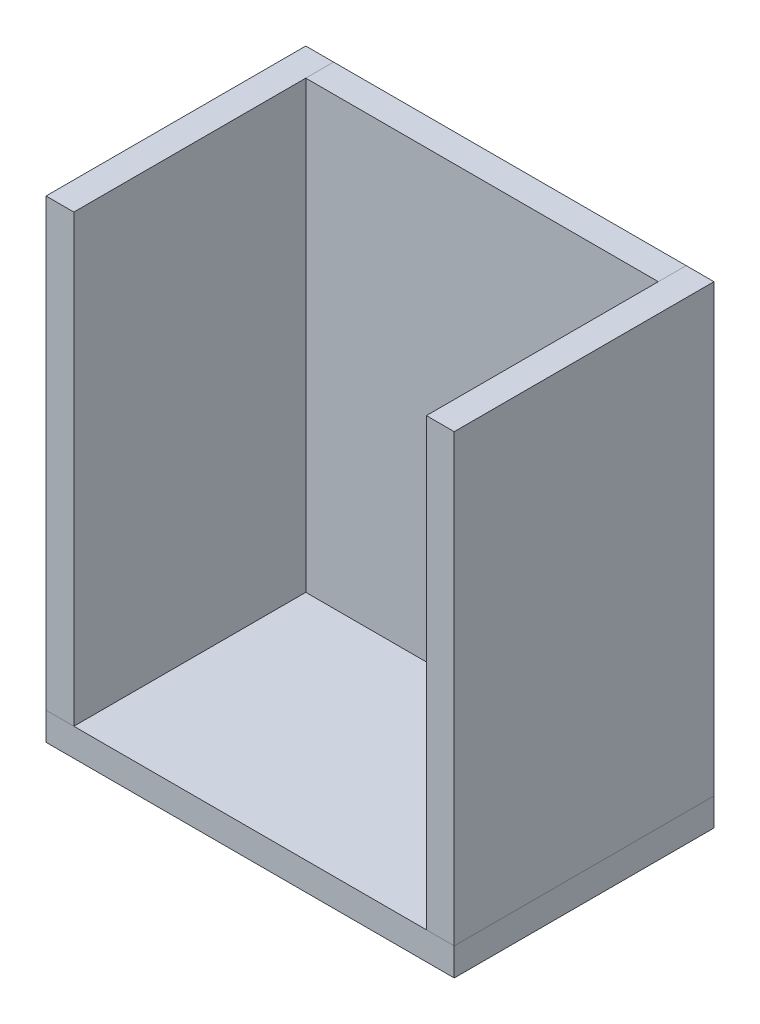
ISO-10303-21;
HEADER;
FILE_DESCRIPTION(('STEP AP214'),'2;1');
FILE_NAME('part.step','',(''),(''),'','','');
FILE_SCHEMA(('AUTOMOTIVE_DESIGN { 1 0 10303 214 1 1 1 1 }'));
ENDSEC;
DATA;
#1=APPLICATION_CONTEXT('core data for automotive mechanical design processes');
#2=APPLICATION_PROTOCOL_DEFINITION('international standard','automotive_design',2000,#1);
#3=PRODUCT_CONTEXT('',#1,'mechanical');
#4=PRODUCT('Part','Part','',(#3));
#5=PRODUCT_RELATED_PRODUCT_CATEGORY('part','',(#4));
#6=PRODUCT_DEFINITION_FORMATION('','',#4);
#7=PRODUCT_DEFINITION_CONTEXT('part definition',#1,'design');
#8=PRODUCT_DEFINITION('design','',#6,#7);
#9=PRODUCT_DEFINITION_SHAPE('','',#8);
#10=(LENGTH_UNIT() NAMED_UNIT(*) SI_UNIT(.MILLI.,.METRE.));
#11=(NAMED_UNIT(*) PLANE_ANGLE_UNIT() SI_UNIT($,.RADIAN.));
#12=(NAMED_UNIT(*) SI_UNIT($,.STERADIAN.) SOLID_ANGLE_UNIT());
#13=UNCERTAINTY_MEASURE_WITH_UNIT(LENGTH_MEASURE(1.E-05),#10,'distance_accuracy_value','');
#14=(GEOMETRIC_REPRESENTATION_CONTEXT(3) GLOBAL_UNCERTAINTY_ASSIGNED_CONTEXT((#13)) GLOBAL_UNIT_ASSIGNED_CONTEXT((#10,
#11,#12)) REPRESENTATION_CONTEXT('',''));
#15=CARTESIAN_POINT('',(0.,0.,0.));
#16=DIRECTION('',(0.,0.,1.));
#17=DIRECTION('',(1.,0.,0.));
#18=AXIS2_PLACEMENT_3D('',#15,#16,#17);
#19=CARTESIAN_POINT('',(-120.65,565.900805617333,0.));
#20=DIRECTION('',(1.,0.,0.));
#21=DIRECTION('',(0.,0.,-1.));
#22=AXIS2_PLACEMENT_3D('',#19,#20,#21);
#23=PLANE('',#22);
#24=DIRECTION('',(0.,0.,1.));
#25=VECTOR('',#24,1.);
#26=CARTESIAN_POINT('',(-120.65,323.85,0.));
#27=LINE('',#26,#25);
#28=CARTESIAN_POINT('',(-120.65,323.85,-88.9));
#29=VERTEX_POINT('',#28);
#30=CARTESIAN_POINT('',(-120.65,323.85,-69.85));
#31=VERTEX_POINT('',#30);
#32=EDGE_CURVE('E66',#29,#31,#27,.T.);
#33=ORIENTED_EDGE('',*,*,#32,.F.);
#34=DIRECTION('',(0.,-1.,0.));
#35=VECTOR('',#34,1.);
#36=CARTESIAN_POINT('',(-120.65,565.900805617333,-88.9));
#37=LINE('',#36,#35);
#38=CARTESIAN_POINT('',(-120.65,19.05,-88.9));
#39=VERTEX_POINT('',#38);
#40=EDGE_CURVE('E60',#29,#39,#37,.T.);
#41=ORIENTED_EDGE('',*,*,#40,.T.);
#42=DIRECTION('',(0.,0.,1.));
#43=VECTOR('',#42,1.);
#44=CARTESIAN_POINT('',(-120.65,19.05,0.));
#45=LINE('',#44,#43);
#46=CARTESIAN_POINT('',(-120.65,19.05,-69.85));
#47=VERTEX_POINT('',#46);
#48=EDGE_CURVE('E124',#39,#47,#45,.T.);
#49=ORIENTED_EDGE('',*,*,#48,.T.);
#50=DIRECTION('',(0.,-1.,0.));
#51=VECTOR('',#50,1.);
#52=CARTESIAN_POINT('',(-120.65,565.900805617333,-69.85));
#53=LINE('',#52,#51);
#54=EDGE_CURVE('E97',#31,#47,#53,.T.);
#55=ORIENTED_EDGE('',*,*,#54,.F.);
#56=EDGE_LOOP('',(#33,#41,#49,#55));
#57=FACE_BOUND('',#56,.T.);
#58=ADVANCED_FACE('F56',(#57),#23,.F.);
#59=CARTESIAN_POINT('',(0.,565.900805617333,-69.85));
#60=DIRECTION('',(0.,0.,-1.));
#61=DIRECTION('',(-1.,0.,0.));
#62=AXIS2_PLACEMENT_3D('',#59,#60,#61);
#63=PLANE('',#62);
#64=DIRECTION('',(1.,0.,0.));
#65=VECTOR('',#64,1.);
#66=CARTESIAN_POINT('',(0.,323.85,-69.85));
#67=LINE('',#66,#65);
#68=CARTESIAN_POINT('',(120.65,323.85,-69.85));
#69=VERTEX_POINT('',#68);
#70=EDGE_CURVE('E12',#31,#69,#67,.T.);
#71=ORIENTED_EDGE('',*,*,#70,.F.);
#72=ORIENTED_EDGE('',*,*,#54,.T.);
#73=DIRECTION('',(1.,0.,0.));
#74=VECTOR('',#73,1.);
#75=CARTESIAN_POINT('',(0.,19.05,-69.85));
#76=LINE('',#75,#74);
#77=CARTESIAN_POINT('',(120.65,19.05,-69.85));
#78=VERTEX_POINT('',#77);
#79=EDGE_CURVE('E111',#47,#78,#76,.T.);
#80=ORIENTED_EDGE('',*,*,#79,.T.);
#81=DIRECTION('',(0.,-1.,0.));
#82=VECTOR('',#81,1.);
#83=CARTESIAN_POINT('',(120.65,565.900805617333,-69.85));
#84=LINE('',#83,#82);
#85=EDGE_CURVE('E108',#69,#78,#84,.T.);
#86=ORIENTED_EDGE('',*,*,#85,.F.);
#87=EDGE_LOOP('',(#71,#72,#80,#86));
#88=FACE_BOUND('',#87,.T.);
#89=ADVANCED_FACE('F113',(#88),#63,.F.);
#90=CARTESIAN_POINT('',(120.65,565.900805617333,0.));
#91=DIRECTION('',(1.,0.,0.));
#92=DIRECTION('',(0.,0.,-1.));
#93=AXIS2_PLACEMENT_3D('',#90,#91,#92);
#94=PLANE('',#93);
#95=DIRECTION('',(0.,-1.,0.));
#96=VECTOR('',#95,1.);
#97=CARTESIAN_POINT('',(120.65,565.900805617333,-88.9));
#98=LINE('',#97,#96);
#99=CARTESIAN_POINT('',(120.65,323.85,-88.9));
#100=VERTEX_POINT('',#99);
#101=CARTESIAN_POINT('',(120.65,19.05,-88.9));
#102=VERTEX_POINT('',#101);
#103=EDGE_CURVE('E79',#100,#102,#98,.T.);
#104=ORIENTED_EDGE('',*,*,#103,.F.);
#105=DIRECTION('',(0.,0.,1.));
#106=VECTOR('',#105,1.);
#107=CARTESIAN_POINT('',(120.65,323.85,0.));
#108=LINE('',#107,#106);
#109=EDGE_CURVE('E105',#100,#69,#108,.T.);
#110=ORIENTED_EDGE('',*,*,#109,.T.);
#111=ORIENTED_EDGE('',*,*,#85,.T.);
#112=DIRECTION('',(0.,0.,1.));
#113=VECTOR('',#112,1.);
#114=CARTESIAN_POINT('',(120.65,19.05,0.));
#115=LINE('',#114,#113);
#116=EDGE_CURVE('E120',#102,#78,#115,.T.);
#117=ORIENTED_EDGE('',*,*,#116,.F.);
#118=EDGE_LOOP('',(#104,#110,#111,#117));
#119=FACE_BOUND('',#118,.T.);
#120=ADVANCED_FACE('F106',(#119),#94,.T.);
#121=CARTESIAN_POINT('',(0.,565.900805617333,-88.9));
#122=DIRECTION('',(0.,0.,1.));
#123=DIRECTION('',(1.,0.,0.));
#124=AXIS2_PLACEMENT_3D('',#121,#122,#123);
#125=PLANE('',#124);
#126=DIRECTION('',(-1.,0.,0.));
#127=VECTOR('',#126,1.);
#128=CARTESIAN_POINT('',(0.,323.85,-88.9));
#129=LINE('',#128,#127);
#130=EDGE_CURVE('E117',#100,#29,#129,.T.);
#131=ORIENTED_EDGE('',*,*,#130,.F.);
#132=ORIENTED_EDGE('',*,*,#103,.T.);
#133=DIRECTION('',(-1.,0.,0.));
#134=VECTOR('',#133,1.);
#135=CARTESIAN_POINT('',(0.,19.05,-88.9));
#136=LINE('',#135,#134);
#137=EDGE_CURVE('E125',#102,#39,#136,.T.);
#138=ORIENTED_EDGE('',*,*,#137,.T.);
#139=ORIENTED_EDGE('',*,*,#40,.F.);
#140=EDGE_LOOP('',(#131,#132,#138,#139));
#141=FACE_BOUND('',#140,.T.);
#142=ADVANCED_FACE('F144',(#141),#125,.F.);
#143=CARTESIAN_POINT('',(0.,19.05,0.));
#144=DIRECTION('',(0.,1.,0.));
#145=DIRECTION('',(0.,0.,1.));
#146=AXIS2_PLACEMENT_3D('',#143,#144,#145);
#147=PLANE('',#146);
#148=ORIENTED_EDGE('',*,*,#48,.F.);
#149=ORIENTED_EDGE('',*,*,#137,.F.);
#150=ORIENTED_EDGE('',*,*,#116,.T.);
#151=ORIENTED_EDGE('',*,*,#79,.F.);
#152=EDGE_LOOP('',(#148,#149,#150,#151));
#153=FACE_BOUND('',#152,.T.);
#154=ADVANCED_FACE('F147',(#153),#147,.F.);
#155=CARTESIAN_POINT('',(0.,323.85,0.));
#156=DIRECTION('',(0.,1.,0.));
#157=DIRECTION('',(0.,0.,1.));
#158=AXIS2_PLACEMENT_3D('',#155,#156,#157);
#159=PLANE('',#158);
#160=ORIENTED_EDGE('',*,*,#130,.T.);
#161=ORIENTED_EDGE('',*,*,#32,.T.);
#162=ORIENTED_EDGE('',*,*,#70,.T.);
#163=ORIENTED_EDGE('',*,*,#109,.F.);
#164=EDGE_LOOP('',(#160,#161,#162,#163));
#165=FACE_BOUND('',#164,.T.);
#166=ADVANCED_FACE('F58',(#165),#159,.T.);
#167=CLOSED_SHELL('',(#58,#89,#120,#142,#154,#166));
#168=MANIFOLD_SOLID_BREP('B2',#167);
#169=CARTESIAN_POINT('',(0.,323.85,-88.9));
#170=DIRECTION('',(0.,0.,1.));
#171=DIRECTION('',(1.,0.,0.));
#172=AXIS2_PLACEMENT_3D('',#169,#170,#171);
#173=PLANE('',#172);
#174=DIRECTION('',(-1.,0.,0.));
#175=VECTOR('',#174,1.);
#176=CARTESIAN_POINT('',(0.,19.05,-88.9));
#177=LINE('',#176,#175);
#178=CARTESIAN_POINT('',(139.7,19.05,-88.9));
#179=VERTEX_POINT('',#178);
#180=CARTESIAN_POINT('',(120.65,19.05,-88.9));
#181=VERTEX_POINT('',#180);
#182=EDGE_CURVE('E292',#179,#181,#177,.T.);
#183=ORIENTED_EDGE('',*,*,#182,.T.);
#184=DIRECTION('',(0.,-1.,0.));
#185=VECTOR('',#184,1.);
#186=CARTESIAN_POINT('',(120.65,323.85,-88.9));
#187=LINE('',#186,#185);
#188=CARTESIAN_POINT('',(120.65,323.85,-88.9));
#189=VERTEX_POINT('',#188);
#190=EDGE_CURVE('E54',#189,#181,#187,.T.);
#191=ORIENTED_EDGE('',*,*,#190,.F.);
#192=DIRECTION('',(-1.,0.,0.));
#193=VECTOR('',#192,1.);
#194=CARTESIAN_POINT('',(0.,323.85,-88.9));
#195=LINE('',#194,#193);
#196=CARTESIAN_POINT('',(139.7,323.85,-88.9));
#197=VERTEX_POINT('',#196);
#198=EDGE_CURVE('E276',#197,#189,#195,.T.);
#199=ORIENTED_EDGE('',*,*,#198,.F.);
#200=DIRECTION('',(0.,-1.,0.));
#201=VECTOR('',#200,1.);
#202=CARTESIAN_POINT('',(139.7,323.85,-88.9));
#203=LINE('',#202,#201);
#204=EDGE_CURVE('E288',#197,#179,#203,.T.);
#205=ORIENTED_EDGE('',*,*,#204,.T.);
#206=EDGE_LOOP('',(#183,#191,#199,#205));
#207=FACE_BOUND('',#206,.T.);
#208=ADVANCED_FACE('F221',(#207),#173,.F.);
#209=CARTESIAN_POINT('',(120.65,323.85,0.));
#210=DIRECTION('',(1.,0.,0.));
#211=DIRECTION('',(0.,0.,-1.));
#212=AXIS2_PLACEMENT_3D('',#209,#210,#211);
#213=PLANE('',#212);
#214=DIRECTION('',(0.,0.,1.));
#215=VECTOR('',#214,1.);
#216=CARTESIAN_POINT('',(120.65,19.05,0.));
#217=LINE('',#216,#215);
#218=CARTESIAN_POINT('',(120.65,19.05,88.9));
#219=VERTEX_POINT('',#218);
#220=EDGE_CURVE('E281',#181,#219,#217,.T.);
#221=ORIENTED_EDGE('',*,*,#220,.T.);
#222=DIRECTION('',(0.,-1.,0.));
#223=VECTOR('',#222,1.);
#224=CARTESIAN_POINT('',(120.65,323.85,88.9));
#225=LINE('',#224,#223);
#226=CARTESIAN_POINT('',(120.65,323.85,88.9));
#227=VERTEX_POINT('',#226);
#228=EDGE_CURVE('E229',#227,#219,#225,.T.);
#229=ORIENTED_EDGE('',*,*,#228,.F.);
#230=DIRECTION('',(0.,0.,1.));
#231=VECTOR('',#230,1.);
#232=CARTESIAN_POINT('',(120.65,323.85,0.));
#233=LINE('',#232,#231);
#234=EDGE_CURVE('E271',#189,#227,#233,.T.);
#235=ORIENTED_EDGE('',*,*,#234,.F.);
#236=ORIENTED_EDGE('',*,*,#190,.T.);
#237=EDGE_LOOP('',(#221,#229,#235,#236));
#238=FACE_BOUND('',#237,.T.);
#239=ADVANCED_FACE('F280',(#238),#213,.F.);
#240=CARTESIAN_POINT('',(0.,323.85,88.9));
#241=DIRECTION('',(0.,0.,-1.));
#242=DIRECTION('',(-1.,0.,0.));
#243=AXIS2_PLACEMENT_3D('',#240,#241,#242);
#244=PLANE('',#243);
#245=DIRECTION('',(1.,0.,0.));
#246=VECTOR('',#245,1.);
#247=CARTESIAN_POINT('',(0.,19.05,88.9));
#248=LINE('',#247,#246);
#249=CARTESIAN_POINT('',(139.7,19.05,88.9));
#250=VERTEX_POINT('',#249);
#251=EDGE_CURVE('E258',#219,#250,#248,.T.);
#252=ORIENTED_EDGE('',*,*,#251,.T.);
#253=DIRECTION('',(0.,-1.,0.));
#254=VECTOR('',#253,1.);
#255=CARTESIAN_POINT('',(139.7,323.85,88.9));
#256=LINE('',#255,#254);
#257=CARTESIAN_POINT('',(139.7,323.85,88.9));
#258=VERTEX_POINT('',#257);
#259=EDGE_CURVE('E283',#258,#250,#256,.T.);
#260=ORIENTED_EDGE('',*,*,#259,.F.);
#261=DIRECTION('',(1.,0.,0.));
#262=VECTOR('',#261,1.);
#263=CARTESIAN_POINT('',(0.,323.85,88.9));
#264=LINE('',#263,#262);
#265=EDGE_CURVE('E274',#227,#258,#264,.T.);
#266=ORIENTED_EDGE('',*,*,#265,.F.);
#267=ORIENTED_EDGE('',*,*,#228,.T.);
#268=EDGE_LOOP('',(#252,#260,#266,#267));
#269=FACE_BOUND('',#268,.T.);
#270=ADVANCED_FACE('F284',(#269),#244,.F.);
#271=CARTESIAN_POINT('',(139.7,323.85,0.));
#272=DIRECTION('',(-1.,0.,0.));
#273=DIRECTION('',(0.,0.,1.));
#274=AXIS2_PLACEMENT_3D('',#271,#272,#273);
#275=PLANE('',#274);
#276=DIRECTION('',(0.,0.,-1.));
#277=VECTOR('',#276,1.);
#278=CARTESIAN_POINT('',(139.7,19.05,0.));
#279=LINE('',#278,#277);
#280=EDGE_CURVE('E264',#250,#179,#279,.T.);
#281=ORIENTED_EDGE('',*,*,#280,.T.);
#282=ORIENTED_EDGE('',*,*,#204,.F.);
#283=DIRECTION('',(0.,0.,-1.));
#284=VECTOR('',#283,1.);
#285=CARTESIAN_POINT('',(139.7,323.85,0.));
#286=LINE('',#285,#284);
#287=EDGE_CURVE('E237',#258,#197,#286,.T.);
#288=ORIENTED_EDGE('',*,*,#287,.F.);
#289=ORIENTED_EDGE('',*,*,#259,.T.);
#290=EDGE_LOOP('',(#281,#282,#288,#289));
#291=FACE_BOUND('',#290,.T.);
#292=ADVANCED_FACE('F303',(#291),#275,.F.);
#293=CARTESIAN_POINT('',(0.,323.85,0.));
#294=DIRECTION('',(0.,1.,0.));
#295=DIRECTION('',(0.,0.,1.));
#296=AXIS2_PLACEMENT_3D('',#293,#294,#295);
#297=PLANE('',#296);
#298=ORIENTED_EDGE('',*,*,#198,.T.);
#299=ORIENTED_EDGE('',*,*,#234,.T.);
#300=ORIENTED_EDGE('',*,*,#265,.T.);
#301=ORIENTED_EDGE('',*,*,#287,.T.);
#302=EDGE_LOOP('',(#298,#299,#300,#301));
#303=FACE_BOUND('',#302,.T.);
#304=ADVANCED_FACE('F272',(#303),#297,.T.);
#305=CARTESIAN_POINT('',(0.,19.05,0.));
#306=DIRECTION('',(0.,1.,0.));
#307=DIRECTION('',(0.,0.,1.));
#308=AXIS2_PLACEMENT_3D('',#305,#306,#307);
#309=PLANE('',#308);
#310=ORIENTED_EDGE('',*,*,#182,.F.);
#311=ORIENTED_EDGE('',*,*,#280,.F.);
#312=ORIENTED_EDGE('',*,*,#251,.F.);
#313=ORIENTED_EDGE('',*,*,#220,.F.);
#314=EDGE_LOOP('',(#310,#311,#312,#313));
#315=FACE_BOUND('',#314,.T.);
#316=ADVANCED_FACE('F306',(#315),#309,.F.);
#317=CLOSED_SHELL('',(#208,#239,#270,#292,#304,#316));
#318=MANIFOLD_SOLID_BREP('B6',#317);
#319=CARTESIAN_POINT('',(-120.65,323.85,0.));
#320=DIRECTION('',(1.,0.,0.));
#321=DIRECTION('',(0.,0.,-1.));
#322=AXIS2_PLACEMENT_3D('',#319,#320,#321);
#323=PLANE('',#322);
#324=DIRECTION('',(0.,0.,1.));
#325=VECTOR('',#324,1.);
#326=CARTESIAN_POINT('',(-120.65,19.05,0.));
#327=LINE('',#326,#325);
#328=CARTESIAN_POINT('',(-120.65,19.05,-88.9));
#329=VERTEX_POINT('',#328);
#330=CARTESIAN_POINT('',(-120.65,19.05,88.9));
#331=VERTEX_POINT('',#330);
#332=EDGE_CURVE('E461',#329,#331,#327,.T.);
#333=ORIENTED_EDGE('',*,*,#332,.F.);
#334=DIRECTION('',(0.,-1.,0.));
#335=VECTOR('',#334,1.);
#336=CARTESIAN_POINT('',(-120.65,323.85,-88.9));
#337=LINE('',#336,#335);
#338=CARTESIAN_POINT('',(-120.65,323.85,-88.9));
#339=VERTEX_POINT('',#338);
#340=EDGE_CURVE('E219',#339,#329,#337,.T.);
#341=ORIENTED_EDGE('',*,*,#340,.F.);
#342=DIRECTION('',(0.,0.,1.));
#343=VECTOR('',#342,1.);
#344=CARTESIAN_POINT('',(-120.65,323.85,0.));
#345=LINE('',#344,#343);
#346=CARTESIAN_POINT('',(-120.65,323.85,88.9));
#347=VERTEX_POINT('',#346);
#348=EDGE_CURVE('E446',#339,#347,#345,.T.);
#349=ORIENTED_EDGE('',*,*,#348,.T.);
#350=DIRECTION('',(0.,-1.,0.));
#351=VECTOR('',#350,1.);
#352=CARTESIAN_POINT('',(-120.65,323.85,88.9));
#353=LINE('',#352,#351);
#354=EDGE_CURVE('E435',#347,#331,#353,.T.);
#355=ORIENTED_EDGE('',*,*,#354,.T.);
#356=EDGE_LOOP('',(#333,#341,#349,#355));
#357=FACE_BOUND('',#356,.T.);
#358=ADVANCED_FACE('F393',(#357),#323,.T.);
#359=CARTESIAN_POINT('',(0.,323.85,-88.9));
#360=DIRECTION('',(0.,0.,1.));
#361=DIRECTION('',(1.,0.,0.));
#362=AXIS2_PLACEMENT_3D('',#359,#360,#361);
#363=PLANE('',#362);
#364=DIRECTION('',(-1.,0.,0.));
#365=VECTOR('',#364,1.);
#366=CARTESIAN_POINT('',(0.,19.05,-88.9));
#367=LINE('',#366,#365);
#368=CARTESIAN_POINT('',(-139.7,19.05,-88.9));
#369=VERTEX_POINT('',#368);
#370=EDGE_CURVE('E451',#329,#369,#367,.T.);
#371=ORIENTED_EDGE('',*,*,#370,.T.);
#372=DIRECTION('',(0.,-1.,0.));
#373=VECTOR('',#372,1.);
#374=CARTESIAN_POINT('',(-139.7,323.85,-88.9));
#375=LINE('',#374,#373);
#376=CARTESIAN_POINT('',(-139.7,323.85,-88.9));
#377=VERTEX_POINT('',#376);
#378=EDGE_CURVE('E402',#377,#369,#375,.T.);
#379=ORIENTED_EDGE('',*,*,#378,.F.);
#380=DIRECTION('',(-1.,0.,0.));
#381=VECTOR('',#380,1.);
#382=CARTESIAN_POINT('',(0.,323.85,-88.9));
#383=LINE('',#382,#381);
#384=EDGE_CURVE('E441',#339,#377,#383,.T.);
#385=ORIENTED_EDGE('',*,*,#384,.F.);
#386=ORIENTED_EDGE('',*,*,#340,.T.);
#387=EDGE_LOOP('',(#371,#379,#385,#386));
#388=FACE_BOUND('',#387,.T.);
#389=ADVANCED_FACE('F449',(#388),#363,.F.);
#390=CARTESIAN_POINT('',(-139.7,323.85,0.));
#391=DIRECTION('',(1.,0.,0.));
#392=DIRECTION('',(0.,0.,-1.));
#393=AXIS2_PLACEMENT_3D('',#390,#391,#392);
#394=PLANE('',#393);
#395=DIRECTION('',(0.,0.,1.));
#396=VECTOR('',#395,1.);
#397=CARTESIAN_POINT('',(-139.7,19.05,0.));
#398=LINE('',#397,#396);
#399=CARTESIAN_POINT('',(-139.7,19.05,88.9));
#400=VERTEX_POINT('',#399);
#401=EDGE_CURVE('E428',#369,#400,#398,.T.);
#402=ORIENTED_EDGE('',*,*,#401,.T.);
#403=DIRECTION('',(0.,-1.,0.));
#404=VECTOR('',#403,1.);
#405=CARTESIAN_POINT('',(-139.7,323.85,88.9));
#406=LINE('',#405,#404);
#407=CARTESIAN_POINT('',(-139.7,323.85,88.9));
#408=VERTEX_POINT('',#407);
#409=EDGE_CURVE('E453',#408,#400,#406,.T.);
#410=ORIENTED_EDGE('',*,*,#409,.F.);
#411=DIRECTION('',(0.,0.,1.));
#412=VECTOR('',#411,1.);
#413=CARTESIAN_POINT('',(-139.7,323.85,0.));
#414=LINE('',#413,#412);
#415=EDGE_CURVE('E445',#377,#408,#414,.T.);
#416=ORIENTED_EDGE('',*,*,#415,.F.);
#417=ORIENTED_EDGE('',*,*,#378,.T.);
#418=EDGE_LOOP('',(#402,#410,#416,#417));
#419=FACE_BOUND('',#418,.T.);
#420=ADVANCED_FACE('F454',(#419),#394,.F.);
#421=CARTESIAN_POINT('',(0.,323.85,88.9));
#422=DIRECTION('',(0.,0.,-1.));
#423=DIRECTION('',(-1.,0.,0.));
#424=AXIS2_PLACEMENT_3D('',#421,#422,#423);
#425=PLANE('',#424);
#426=DIRECTION('',(1.,0.,0.));
#427=VECTOR('',#426,1.);
#428=CARTESIAN_POINT('',(0.,19.05,88.9));
#429=LINE('',#428,#427);
#430=EDGE_CURVE('E469',#400,#331,#429,.T.);
#431=ORIENTED_EDGE('',*,*,#430,.T.);
#432=ORIENTED_EDGE('',*,*,#354,.F.);
#433=DIRECTION('',(1.,0.,0.));
#434=VECTOR('',#433,1.);
#435=CARTESIAN_POINT('',(0.,323.85,88.9));
#436=LINE('',#435,#434);
#437=EDGE_CURVE('E410',#408,#347,#436,.T.);
#438=ORIENTED_EDGE('',*,*,#437,.F.);
#439=ORIENTED_EDGE('',*,*,#409,.T.);
#440=EDGE_LOOP('',(#431,#432,#438,#439));
#441=FACE_BOUND('',#440,.T.);
#442=ADVANCED_FACE('F474',(#441),#425,.F.);
#443=CARTESIAN_POINT('',(0.,323.85,0.));
#444=DIRECTION('',(0.,1.,0.));
#445=DIRECTION('',(0.,0.,1.));
#446=AXIS2_PLACEMENT_3D('',#443,#444,#445);
#447=PLANE('',#446);
#448=ORIENTED_EDGE('',*,*,#348,.F.);
#449=ORIENTED_EDGE('',*,*,#384,.T.);
#450=ORIENTED_EDGE('',*,*,#415,.T.);
#451=ORIENTED_EDGE('',*,*,#437,.T.);
#452=EDGE_LOOP('',(#448,#449,#450,#451));
#453=FACE_BOUND('',#452,.T.);
#454=ADVANCED_FACE('F443',(#453),#447,.T.);
#455=CARTESIAN_POINT('',(0.,19.05,0.));
#456=DIRECTION('',(0.,1.,0.));
#457=DIRECTION('',(0.,0.,1.));
#458=AXIS2_PLACEMENT_3D('',#455,#456,#457);
#459=PLANE('',#458);
#460=ORIENTED_EDGE('',*,*,#332,.T.);
#461=ORIENTED_EDGE('',*,*,#430,.F.);
#462=ORIENTED_EDGE('',*,*,#401,.F.);
#463=ORIENTED_EDGE('',*,*,#370,.F.);
#464=EDGE_LOOP('',(#460,#461,#462,#463));
#465=FACE_BOUND('',#464,.T.);
#466=ADVANCED_FACE('F476',(#465),#459,.F.);
#467=CLOSED_SHELL('',(#358,#389,#420,#442,#454,#466));
#468=MANIFOLD_SOLID_BREP('B48',#467);
#469=CARTESIAN_POINT('',(139.7,19.05,-88.9));
#470=DIRECTION('',(-1.,0.,0.));
#471=DIRECTION('',(0.,0.,1.));
#472=AXIS2_PLACEMENT_3D('',#469,#470,#471);
#473=PLANE('',#472);
#474=DIRECTION('',(0.,0.,-1.));
#475=VECTOR('',#474,1.);
#476=CARTESIAN_POINT('',(139.7,0.,-88.9));
#477=LINE('',#476,#475);
#478=CARTESIAN_POINT('',(139.7,0.,88.9));
#479=VERTEX_POINT('',#478);
#480=CARTESIAN_POINT('',(139.7,0.,-88.9));
#481=VERTEX_POINT('',#480);
#482=EDGE_CURVE('E627',#479,#481,#477,.T.);
#483=ORIENTED_EDGE('',*,*,#482,.T.);
#484=DIRECTION('',(0.,-1.,0.));
#485=VECTOR('',#484,1.);
#486=CARTESIAN_POINT('',(139.7,19.05,-88.9));
#487=LINE('',#486,#485);
#488=CARTESIAN_POINT('',(139.7,19.05,-88.9));
#489=VERTEX_POINT('',#488);
#490=EDGE_CURVE('E391',#489,#481,#487,.T.);
#491=ORIENTED_EDGE('',*,*,#490,.F.);
#492=DIRECTION('',(0.,0.,-1.));
#493=VECTOR('',#492,1.);
#494=CARTESIAN_POINT('',(139.7,19.05,-88.9));
#495=LINE('',#494,#493);
#496=CARTESIAN_POINT('',(139.7,19.05,88.9));
#497=VERTEX_POINT('',#496);
#498=EDGE_CURVE('E609',#497,#489,#495,.T.);
#499=ORIENTED_EDGE('',*,*,#498,.F.);
#500=DIRECTION('',(0.,-1.,0.));
#501=VECTOR('',#500,1.);
#502=CARTESIAN_POINT('',(139.7,19.05,88.9));
#503=LINE('',#502,#501);
#504=EDGE_CURVE('E623',#497,#479,#503,.T.);
#505=ORIENTED_EDGE('',*,*,#504,.T.);
#506=EDGE_LOOP('',(#483,#491,#499,#505));
#507=FACE_BOUND('',#506,.T.);
#508=ADVANCED_FACE('F554',(#507),#473,.F.);
#509=CARTESIAN_POINT('',(-139.7,19.05,-88.9));
#510=DIRECTION('',(0.,0.,1.));
#511=DIRECTION('',(1.,0.,0.));
#512=AXIS2_PLACEMENT_3D('',#509,#510,#511);
#513=PLANE('',#512);
#514=DIRECTION('',(-1.,0.,0.));
#515=VECTOR('',#514,1.);
#516=CARTESIAN_POINT('',(-139.7,0.,-88.9));
#517=LINE('',#516,#515);
#518=CARTESIAN_POINT('',(-139.7,0.,-88.9));
#519=VERTEX_POINT('',#518);
#520=EDGE_CURVE('E614',#481,#519,#517,.T.);
#521=ORIENTED_EDGE('',*,*,#520,.T.);
#522=DIRECTION('',(0.,-1.,0.));
#523=VECTOR('',#522,1.);
#524=CARTESIAN_POINT('',(-139.7,19.05,-88.9));
#525=LINE('',#524,#523);
#526=CARTESIAN_POINT('',(-139.7,19.05,-88.9));
#527=VERTEX_POINT('',#526);
#528=EDGE_CURVE('E562',#527,#519,#525,.T.);
#529=ORIENTED_EDGE('',*,*,#528,.F.);
#530=DIRECTION('',(-1.,0.,0.));
#531=VECTOR('',#530,1.);
#532=CARTESIAN_POINT('',(-139.7,19.05,-88.9));
#533=LINE('',#532,#531);
#534=EDGE_CURVE('E604',#489,#527,#533,.T.);
#535=ORIENTED_EDGE('',*,*,#534,.F.);
#536=ORIENTED_EDGE('',*,*,#490,.T.);
#537=EDGE_LOOP('',(#521,#529,#535,#536));
#538=FACE_BOUND('',#537,.T.);
#539=ADVANCED_FACE('F613',(#538),#513,.F.);
#540=CARTESIAN_POINT('',(-139.7,19.05,-88.9));
#541=DIRECTION('',(1.,0.,0.));
#542=DIRECTION('',(0.,0.,-1.));
#543=AXIS2_PLACEMENT_3D('',#540,#541,#542);
#544=PLANE('',#543);
#545=DIRECTION('',(0.,0.,1.));
#546=VECTOR('',#545,1.);
#547=CARTESIAN_POINT('',(-139.7,0.,-88.9));
#548=LINE('',#547,#546);
#549=CARTESIAN_POINT('',(-139.7,0.,88.9));
#550=VERTEX_POINT('',#549);
#551=EDGE_CURVE('E590',#519,#550,#548,.T.);
#552=ORIENTED_EDGE('',*,*,#551,.T.);
#553=DIRECTION('',(0.,-1.,0.));
#554=VECTOR('',#553,1.);
#555=CARTESIAN_POINT('',(-139.7,19.05,88.9));
#556=LINE('',#555,#554);
#557=CARTESIAN_POINT('',(-139.7,19.05,88.9));
#558=VERTEX_POINT('',#557);
#559=EDGE_CURVE('E616',#558,#550,#556,.T.);
#560=ORIENTED_EDGE('',*,*,#559,.F.);
#561=DIRECTION('',(0.,0.,1.));
#562=VECTOR('',#561,1.);
#563=CARTESIAN_POINT('',(-139.7,19.05,-88.9));
#564=LINE('',#563,#562);
#565=EDGE_CURVE('E607',#527,#558,#564,.T.);
#566=ORIENTED_EDGE('',*,*,#565,.F.);
#567=ORIENTED_EDGE('',*,*,#528,.T.);
#568=EDGE_LOOP('',(#552,#560,#566,#567));
#569=FACE_BOUND('',#568,.T.);
#570=ADVANCED_FACE('F617',(#569),#544,.F.);
#571=CARTESIAN_POINT('',(-139.7,19.05,88.9));
#572=DIRECTION('',(0.,0.,-1.));
#573=DIRECTION('',(-1.,0.,0.));
#574=AXIS2_PLACEMENT_3D('',#571,#572,#573);
#575=PLANE('',#574);
#576=DIRECTION('',(1.,0.,0.));
#577=VECTOR('',#576,1.);
#578=CARTESIAN_POINT('',(-139.7,0.,88.9));
#579=LINE('',#578,#577);
#580=EDGE_CURVE('E597',#550,#479,#579,.T.);
#581=ORIENTED_EDGE('',*,*,#580,.T.);
#582=ORIENTED_EDGE('',*,*,#504,.F.);
#583=DIRECTION('',(1.,0.,0.));
#584=VECTOR('',#583,1.);
#585=CARTESIAN_POINT('',(-139.7,19.05,88.9));
#586=LINE('',#585,#584);
#587=EDGE_CURVE('E572',#558,#497,#586,.T.);
#588=ORIENTED_EDGE('',*,*,#587,.F.);
#589=ORIENTED_EDGE('',*,*,#559,.T.);
#590=EDGE_LOOP('',(#581,#582,#588,#589));
#591=FACE_BOUND('',#590,.T.);
#592=ADVANCED_FACE('F637',(#591),#575,.F.);
#593=CARTESIAN_POINT('',(0.,19.05,0.));
#594=DIRECTION('',(0.,1.,0.));
#595=DIRECTION('',(0.,0.,1.));
#596=AXIS2_PLACEMENT_3D('',#593,#594,#595);
#597=PLANE('',#596);
#598=ORIENTED_EDGE('',*,*,#498,.T.);
#599=ORIENTED_EDGE('',*,*,#534,.T.);
#600=ORIENTED_EDGE('',*,*,#565,.T.);
#601=ORIENTED_EDGE('',*,*,#587,.T.);
#602=EDGE_LOOP('',(#598,#599,#600,#601));
#603=FACE_BOUND('',#602,.T.);
#604=ADVANCED_FACE('F605',(#603),#597,.T.);
#605=CARTESIAN_POINT('',(0.,0.,0.));
#606=DIRECTION('',(0.,1.,0.));
#607=DIRECTION('',(0.,0.,1.));
#608=AXIS2_PLACEMENT_3D('',#605,#606,#607);
#609=PLANE('',#608);
#610=ORIENTED_EDGE('',*,*,#482,.F.);
#611=ORIENTED_EDGE('',*,*,#580,.F.);
#612=ORIENTED_EDGE('',*,*,#551,.F.);
#613=ORIENTED_EDGE('',*,*,#520,.F.);
#614=EDGE_LOOP('',(#610,#611,#612,#613));
#615=FACE_BOUND('',#614,.T.);
#616=ADVANCED_FACE('F640',(#615),#609,.F.);
#617=CLOSED_SHELL('',(#508,#539,#570,#592,#604,#616));
#618=MANIFOLD_SOLID_BREP('B213',#617);
#619=ADVANCED_BREP_SHAPE_REPRESENTATION('',(#18,#168,#318,#468,#618),#14);
#620=SHAPE_DEFINITION_REPRESENTATION(#9,#619);
ENDSEC;
END-ISO-10303-21;
